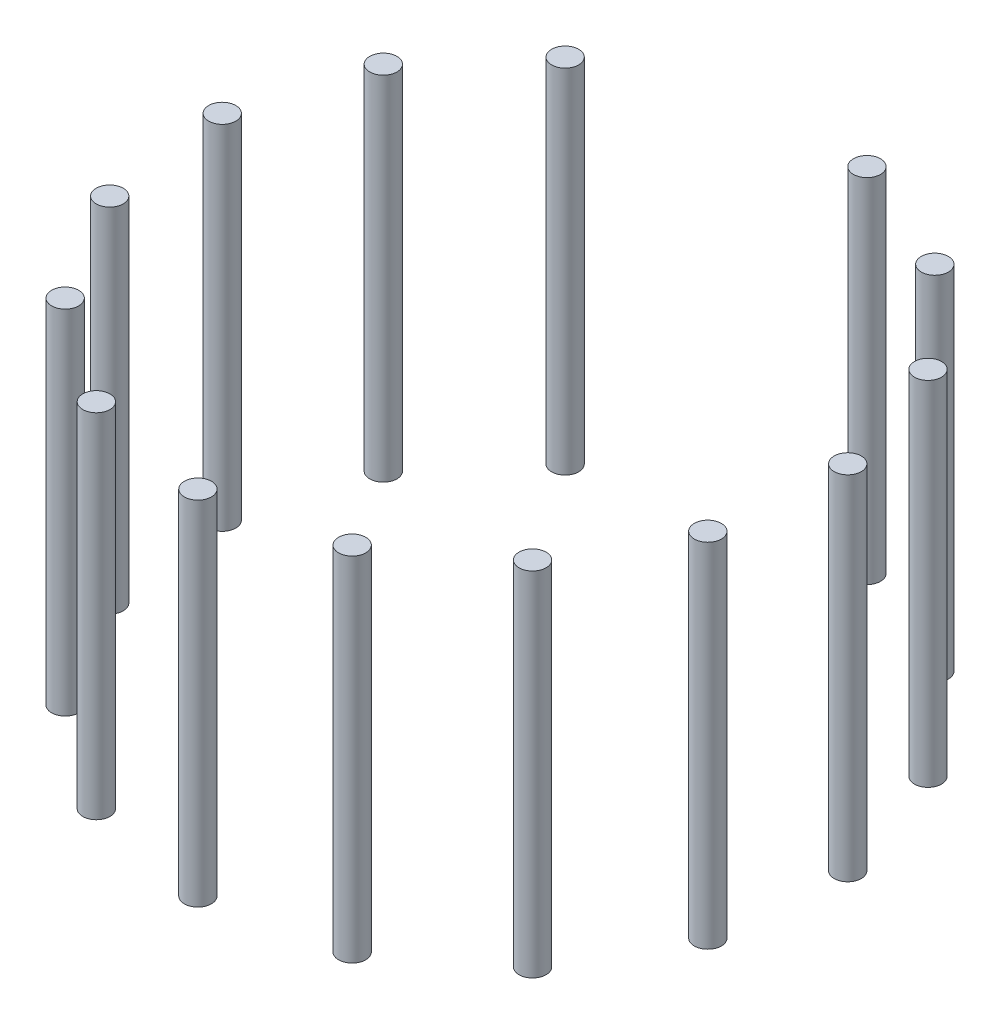
ISO-10303-21;
HEADER;
FILE_DESCRIPTION(('STEP AP214'),'2;1');
FILE_NAME('part.step','',(''),(''),'','','');
FILE_SCHEMA(('AUTOMOTIVE_DESIGN { 1 0 10303 214 1 1 1 1 }'));
ENDSEC;
DATA;
#1=APPLICATION_CONTEXT('core data for automotive mechanical design processes');
#2=APPLICATION_PROTOCOL_DEFINITION('international standard','automotive_design',2000,#1);
#3=PRODUCT_CONTEXT('',#1,'mechanical');
#4=PRODUCT('Part','Part','',(#3));
#5=PRODUCT_RELATED_PRODUCT_CATEGORY('part','',(#4));
#6=PRODUCT_DEFINITION_FORMATION('','',#4);
#7=PRODUCT_DEFINITION_CONTEXT('part definition',#1,'design');
#8=PRODUCT_DEFINITION('design','',#6,#7);
#9=PRODUCT_DEFINITION_SHAPE('','',#8);
#10=(LENGTH_UNIT() NAMED_UNIT(*) SI_UNIT(.MILLI.,.METRE.));
#11=(NAMED_UNIT(*) PLANE_ANGLE_UNIT() SI_UNIT($,.RADIAN.));
#12=(NAMED_UNIT(*) SI_UNIT($,.STERADIAN.) SOLID_ANGLE_UNIT());
#13=UNCERTAINTY_MEASURE_WITH_UNIT(LENGTH_MEASURE(1.E-05),#10,'distance_accuracy_value','');
#14=(GEOMETRIC_REPRESENTATION_CONTEXT(3) GLOBAL_UNCERTAINTY_ASSIGNED_CONTEXT((#13)) GLOBAL_UNIT_ASSIGNED_CONTEXT((#10,
#11,#12)) REPRESENTATION_CONTEXT('',''));
#15=CARTESIAN_POINT('',(0.,0.,0.));
#16=DIRECTION('',(0.,0.,1.));
#17=DIRECTION('',(1.,0.,0.));
#18=AXIS2_PLACEMENT_3D('',#15,#16,#17);
#19=CARTESIAN_POINT('',(8.64512657190612,9.1,-7.71661239147951));
#20=DIRECTION('',(0.,-1.,0.));
#21=DIRECTION('',(0.,0.,-1.));
#22=AXIS2_PLACEMENT_3D('',#19,#20,#21);
#23=CYLINDRICAL_SURFACE('',#22,0.350000000000002);
#24=CARTESIAN_POINT('',(8.64512657190612,9.1,-7.71661239147951));
#25=DIRECTION('',(0.,1.,0.));
#26=DIRECTION('',(0.,0.,1.));
#27=AXIS2_PLACEMENT_3D('',#24,#25,#26);
#28=CIRCLE('',#27,0.350000000000002);
#29=CARTESIAN_POINT('',(8.64512657190612,9.1,-7.36661239147951));
#30=VERTEX_POINT('',#29);
#31=EDGE_CURVE('E11',#30,#30,#28,.T.);
#32=ORIENTED_EDGE('',*,*,#31,.F.);
#33=EDGE_LOOP('',(#32));
#34=FACE_BOUND('',#33,.T.);
#35=CARTESIAN_POINT('',(8.64512657190612,0.,-7.71661239147951));
#36=DIRECTION('',(0.,1.,0.));
#37=DIRECTION('',(0.,0.,1.));
#38=AXIS2_PLACEMENT_3D('',#35,#36,#37);
#39=CIRCLE('',#38,0.350000000000002);
#40=CARTESIAN_POINT('',(8.64512657190612,0.,-7.36661239147951));
#41=VERTEX_POINT('',#40);
#42=EDGE_CURVE('E45',#41,#41,#39,.T.);
#43=ORIENTED_EDGE('',*,*,#42,.T.);
#44=EDGE_LOOP('',(#43));
#45=FACE_BOUND('',#44,.T.);
#46=ADVANCED_FACE('F42',(#34,#45),#23,.T.);
#47=CARTESIAN_POINT('',(8.64512657190612,9.1,-7.71661239147951));
#48=DIRECTION('',(0.,1.,0.));
#49=DIRECTION('',(0.,0.,1.));
#50=AXIS2_PLACEMENT_3D('',#47,#48,#49);
#51=PLANE('',#50);
#52=ORIENTED_EDGE('',*,*,#31,.T.);
#53=EDGE_LOOP('',(#52));
#54=FACE_BOUND('',#53,.T.);
#55=ADVANCED_FACE('F57',(#54),#51,.T.);
#56=CARTESIAN_POINT('',(8.64512657190612,0.,-7.71661239147951));
#57=DIRECTION('',(0.,1.,0.));
#58=DIRECTION('',(0.,0.,1.));
#59=AXIS2_PLACEMENT_3D('',#56,#57,#58);
#60=PLANE('',#59);
#61=ORIENTED_EDGE('',*,*,#42,.F.);
#62=EDGE_LOOP('',(#61));
#63=FACE_BOUND('',#62,.T.);
#64=ADVANCED_FACE('F55',(#63),#60,.F.);
#65=CLOSED_SHELL('',(#46,#55,#64));
#66=MANIFOLD_SOLID_BREP('B2',#65);
#67=CARTESIAN_POINT('',(6.45643612447235,9.1,-5.21145460262483));
#68=DIRECTION('',(0.,-1.,0.));
#69=DIRECTION('',(0.,0.,-1.));
#70=AXIS2_PLACEMENT_3D('',#67,#68,#69);
#71=CYLINDRICAL_SURFACE('',#70,0.35);
#72=CARTESIAN_POINT('',(6.45643612447235,9.1,-5.21145460262483));
#73=DIRECTION('',(0.,1.,0.));
#74=DIRECTION('',(0.,0.,1.));
#75=AXIS2_PLACEMENT_3D('',#72,#73,#74);
#76=CIRCLE('',#75,0.35);
#77=CARTESIAN_POINT('',(6.45643612447235,9.1,-4.86145460262483));
#78=VERTEX_POINT('',#77);
#79=EDGE_CURVE('E41',#78,#78,#76,.T.);
#80=ORIENTED_EDGE('',*,*,#79,.F.);
#81=EDGE_LOOP('',(#80));
#82=FACE_BOUND('',#81,.T.);
#83=CARTESIAN_POINT('',(6.45643612447235,0.,-5.21145460262483));
#84=DIRECTION('',(0.,1.,0.));
#85=DIRECTION('',(0.,0.,1.));
#86=AXIS2_PLACEMENT_3D('',#83,#84,#85);
#87=CIRCLE('',#86,0.35);
#88=CARTESIAN_POINT('',(6.45643612447235,0.,-4.86145460262483));
#89=VERTEX_POINT('',#88);
#90=EDGE_CURVE('E94',#89,#89,#87,.T.);
#91=ORIENTED_EDGE('',*,*,#90,.T.);
#92=EDGE_LOOP('',(#91));
#93=FACE_BOUND('',#92,.T.);
#94=ADVANCED_FACE('F91',(#82,#93),#71,.T.);
#95=CARTESIAN_POINT('',(6.45643612447235,9.1,-5.21145460262483));
#96=DIRECTION('',(0.,1.,0.));
#97=DIRECTION('',(0.,0.,1.));
#98=AXIS2_PLACEMENT_3D('',#95,#96,#97);
#99=PLANE('',#98);
#100=ORIENTED_EDGE('',*,*,#79,.T.);
#101=EDGE_LOOP('',(#100));
#102=FACE_BOUND('',#101,.T.);
#103=ADVANCED_FACE('F106',(#102),#99,.T.);
#104=CARTESIAN_POINT('',(6.45643612447235,0.,-5.21145460262483));
#105=DIRECTION('',(0.,1.,0.));
#106=DIRECTION('',(0.,0.,1.));
#107=AXIS2_PLACEMENT_3D('',#104,#105,#106);
#108=PLANE('',#107);
#109=ORIENTED_EDGE('',*,*,#90,.F.);
#110=EDGE_LOOP('',(#109));
#111=FACE_BOUND('',#110,.T.);
#112=ADVANCED_FACE('F104',(#111),#108,.F.);
#113=CLOSED_SHELL('',(#94,#103,#112));
#114=MANIFOLD_SOLID_BREP('B6',#113);
#115=CARTESIAN_POINT('',(5.47590737744742,9.1,-2.03265847861736));
#116=DIRECTION('',(0.,-1.,0.));
#117=DIRECTION('',(0.,0.,-1.));
#118=AXIS2_PLACEMENT_3D('',#115,#116,#117);
#119=CYLINDRICAL_SURFACE('',#118,0.35);
#120=CARTESIAN_POINT('',(5.47590737744742,9.1,-2.03265847861736));
#121=DIRECTION('',(0.,1.,0.));
#122=DIRECTION('',(0.,0.,1.));
#123=AXIS2_PLACEMENT_3D('',#120,#121,#122);
#124=CIRCLE('',#123,0.35);
#125=CARTESIAN_POINT('',(5.47590737744742,9.1,-1.68265847861736));
#126=VERTEX_POINT('',#125);
#127=EDGE_CURVE('E90',#126,#126,#124,.T.);
#128=ORIENTED_EDGE('',*,*,#127,.F.);
#129=EDGE_LOOP('',(#128));
#130=FACE_BOUND('',#129,.T.);
#131=CARTESIAN_POINT('',(5.47590737744742,0.,-2.03265847861736));
#132=DIRECTION('',(0.,1.,0.));
#133=DIRECTION('',(0.,0.,1.));
#134=AXIS2_PLACEMENT_3D('',#131,#132,#133);
#135=CIRCLE('',#134,0.35);
#136=CARTESIAN_POINT('',(5.47590737744742,0.,-1.68265847861736));
#137=VERTEX_POINT('',#136);
#138=EDGE_CURVE('E143',#137,#137,#135,.T.);
#139=ORIENTED_EDGE('',*,*,#138,.T.);
#140=EDGE_LOOP('',(#139));
#141=FACE_BOUND('',#140,.T.);
#142=ADVANCED_FACE('F140',(#130,#141),#119,.T.);
#143=CARTESIAN_POINT('',(5.47590737744742,9.1,-2.03265847861736));
#144=DIRECTION('',(0.,1.,0.));
#145=DIRECTION('',(0.,0.,1.));
#146=AXIS2_PLACEMENT_3D('',#143,#144,#145);
#147=PLANE('',#146);
#148=ORIENTED_EDGE('',*,*,#127,.T.);
#149=EDGE_LOOP('',(#148));
#150=FACE_BOUND('',#149,.T.);
#151=ADVANCED_FACE('F155',(#150),#147,.T.);
#152=CARTESIAN_POINT('',(5.47590737744742,0.,-2.03265847861736));
#153=DIRECTION('',(0.,1.,0.));
#154=DIRECTION('',(0.,0.,1.));
#155=AXIS2_PLACEMENT_3D('',#152,#153,#154);
#156=PLANE('',#155);
#157=ORIENTED_EDGE('',*,*,#138,.F.);
#158=EDGE_LOOP('',(#157));
#159=FACE_BOUND('',#158,.T.);
#160=ADVANCED_FACE('F153',(#159),#156,.F.);
#161=CLOSED_SHELL('',(#142,#151,#160));
#162=MANIFOLD_SOLID_BREP('B36',#161);
#163=CARTESIAN_POINT('',(5.87308265901598,9.1,1.2701332522458));
#164=DIRECTION('',(0.,-1.,0.));
#165=DIRECTION('',(0.,0.,-1.));
#166=AXIS2_PLACEMENT_3D('',#163,#164,#165);
#167=CYLINDRICAL_SURFACE('',#166,0.35);
#168=CARTESIAN_POINT('',(5.87308265901598,9.1,1.2701332522458));
#169=DIRECTION('',(0.,1.,0.));
#170=DIRECTION('',(0.,0.,1.));
#171=AXIS2_PLACEMENT_3D('',#168,#169,#170);
#172=CIRCLE('',#171,0.35);
#173=CARTESIAN_POINT('',(5.87308265901598,9.1,1.6201332522458));
#174=VERTEX_POINT('',#173);
#175=EDGE_CURVE('E139',#174,#174,#172,.T.);
#176=ORIENTED_EDGE('',*,*,#175,.F.);
#177=EDGE_LOOP('',(#176));
#178=FACE_BOUND('',#177,.T.);
#179=CARTESIAN_POINT('',(5.87308265901598,0.,1.2701332522458));
#180=DIRECTION('',(0.,1.,0.));
#181=DIRECTION('',(0.,0.,1.));
#182=AXIS2_PLACEMENT_3D('',#179,#180,#181);
#183=CIRCLE('',#182,0.35);
#184=CARTESIAN_POINT('',(5.87308265901598,0.,1.6201332522458));
#185=VERTEX_POINT('',#184);
#186=EDGE_CURVE('E192',#185,#185,#183,.T.);
#187=ORIENTED_EDGE('',*,*,#186,.T.);
#188=EDGE_LOOP('',(#187));
#189=FACE_BOUND('',#188,.T.);
#190=ADVANCED_FACE('F189',(#178,#189),#167,.T.);
#191=CARTESIAN_POINT('',(5.87308265901598,9.1,1.2701332522458));
#192=DIRECTION('',(0.,1.,0.));
#193=DIRECTION('',(0.,0.,1.));
#194=AXIS2_PLACEMENT_3D('',#191,#192,#193);
#195=PLANE('',#194);
#196=ORIENTED_EDGE('',*,*,#175,.T.);
#197=EDGE_LOOP('',(#196));
#198=FACE_BOUND('',#197,.T.);
#199=ADVANCED_FACE('F204',(#198),#195,.T.);
#200=CARTESIAN_POINT('',(5.87308265901598,0.,1.2701332522458));
#201=DIRECTION('',(0.,1.,0.));
#202=DIRECTION('',(0.,0.,1.));
#203=AXIS2_PLACEMENT_3D('',#200,#201,#202);
#204=PLANE('',#203);
#205=ORIENTED_EDGE('',*,*,#186,.F.);
#206=EDGE_LOOP('',(#205));
#207=FACE_BOUND('',#206,.T.);
#208=ADVANCED_FACE('F202',(#207),#204,.F.);
#209=CLOSED_SHELL('',(#190,#199,#208));
#210=MANIFOLD_SOLID_BREP('B85',#209);
#211=CARTESIAN_POINT('',(7.57928675477065,9.1,4.1258378947775));
#212=DIRECTION('',(0.,-1.,0.));
#213=DIRECTION('',(0.,0.,-1.));
#214=AXIS2_PLACEMENT_3D('',#211,#212,#213);
#215=CYLINDRICAL_SURFACE('',#214,0.349999999999999);
#216=CARTESIAN_POINT('',(7.57928675477065,9.1,4.1258378947775));
#217=DIRECTION('',(0.,1.,0.));
#218=DIRECTION('',(0.,0.,1.));
#219=AXIS2_PLACEMENT_3D('',#216,#217,#218);
#220=CIRCLE('',#219,0.349999999999999);
#221=CARTESIAN_POINT('',(7.57928675477065,9.1,4.47583789477749));
#222=VERTEX_POINT('',#221);
#223=EDGE_CURVE('E188',#222,#222,#220,.T.);
#224=ORIENTED_EDGE('',*,*,#223,.F.);
#225=EDGE_LOOP('',(#224));
#226=FACE_BOUND('',#225,.T.);
#227=CARTESIAN_POINT('',(7.57928675477065,0.,4.1258378947775));
#228=DIRECTION('',(0.,1.,0.));
#229=DIRECTION('',(0.,0.,1.));
#230=AXIS2_PLACEMENT_3D('',#227,#228,#229);
#231=CIRCLE('',#230,0.349999999999999);
#232=CARTESIAN_POINT('',(7.57928675477065,0.,4.47583789477749));
#233=VERTEX_POINT('',#232);
#234=EDGE_CURVE('E241',#233,#233,#231,.T.);
#235=ORIENTED_EDGE('',*,*,#234,.T.);
#236=EDGE_LOOP('',(#235));
#237=FACE_BOUND('',#236,.T.);
#238=ADVANCED_FACE('F238',(#226,#237),#215,.T.);
#239=CARTESIAN_POINT('',(7.57928675477065,9.1,4.1258378947775));
#240=DIRECTION('',(0.,1.,0.));
#241=DIRECTION('',(0.,0.,1.));
#242=AXIS2_PLACEMENT_3D('',#239,#240,#241);
#243=PLANE('',#242);
#244=ORIENTED_EDGE('',*,*,#223,.T.);
#245=EDGE_LOOP('',(#244));
#246=FACE_BOUND('',#245,.T.);
#247=ADVANCED_FACE('F253',(#246),#243,.T.);
#248=CARTESIAN_POINT('',(7.57928675477065,0.,4.1258378947775));
#249=DIRECTION('',(0.,1.,0.));
#250=DIRECTION('',(0.,0.,1.));
#251=AXIS2_PLACEMENT_3D('',#248,#249,#250);
#252=PLANE('',#251);
#253=ORIENTED_EDGE('',*,*,#234,.F.);
#254=EDGE_LOOP('',(#253));
#255=FACE_BOUND('',#254,.T.);
#256=ADVANCED_FACE('F251',(#255),#252,.F.);
#257=CLOSED_SHELL('',(#238,#247,#256));
#258=MANIFOLD_SOLID_BREP('B134',#257);
#259=CARTESIAN_POINT('',(10.2995014761779,9.1,6.04067817302178));
#260=DIRECTION('',(0.,-1.,0.));
#261=DIRECTION('',(0.,0.,-1.));
#262=AXIS2_PLACEMENT_3D('',#259,#260,#261);
#263=CYLINDRICAL_SURFACE('',#262,0.35);
#264=CARTESIAN_POINT('',(10.2995014761779,9.1,6.04067817302178));
#265=DIRECTION('',(0.,1.,0.));
#266=DIRECTION('',(0.,0.,1.));
#267=AXIS2_PLACEMENT_3D('',#264,#265,#266);
#268=CIRCLE('',#267,0.35);
#269=CARTESIAN_POINT('',(10.2995014761779,9.1,6.39067817302178));
#270=VERTEX_POINT('',#269);
#271=EDGE_CURVE('E237',#270,#270,#268,.T.);
#272=ORIENTED_EDGE('',*,*,#271,.F.);
#273=EDGE_LOOP('',(#272));
#274=FACE_BOUND('',#273,.T.);
#275=CARTESIAN_POINT('',(10.2995014761779,0.,6.04067817302178));
#276=DIRECTION('',(0.,1.,0.));
#277=DIRECTION('',(0.,0.,1.));
#278=AXIS2_PLACEMENT_3D('',#275,#276,#277);
#279=CIRCLE('',#278,0.35);
#280=CARTESIAN_POINT('',(10.2995014761779,0.,6.39067817302178));
#281=VERTEX_POINT('',#280);
#282=EDGE_CURVE('E290',#281,#281,#279,.T.);
#283=ORIENTED_EDGE('',*,*,#282,.T.);
#284=EDGE_LOOP('',(#283));
#285=FACE_BOUND('',#284,.T.);
#286=ADVANCED_FACE('F287',(#274,#285),#263,.T.);
#287=CARTESIAN_POINT('',(10.2995014761779,9.1,6.04067817302178));
#288=DIRECTION('',(0.,1.,0.));
#289=DIRECTION('',(0.,0.,1.));
#290=AXIS2_PLACEMENT_3D('',#287,#288,#289);
#291=PLANE('',#290);
#292=ORIENTED_EDGE('',*,*,#271,.T.);
#293=EDGE_LOOP('',(#292));
#294=FACE_BOUND('',#293,.T.);
#295=ADVANCED_FACE('F302',(#294),#291,.T.);
#296=CARTESIAN_POINT('',(10.2995014761779,0.,6.04067817302178));
#297=DIRECTION('',(0.,1.,0.));
#298=DIRECTION('',(0.,0.,1.));
#299=AXIS2_PLACEMENT_3D('',#296,#297,#298);
#300=PLANE('',#299);
#301=ORIENTED_EDGE('',*,*,#282,.F.);
#302=EDGE_LOOP('',(#301));
#303=FACE_BOUND('',#302,.T.);
#304=ADVANCED_FACE('F300',(#303),#300,.F.);
#305=CLOSED_SHELL('',(#286,#295,#304));
#306=MANIFOLD_SOLID_BREP('B183',#305);
#307=CARTESIAN_POINT('',(13.5633769855314,9.1,6.68356080709241));
#308=DIRECTION('',(0.,-1.,0.));
#309=DIRECTION('',(0.,0.,-1.));
#310=AXIS2_PLACEMENT_3D('',#307,#308,#309);
#311=CYLINDRICAL_SURFACE('',#310,0.349999999999999);
#312=CARTESIAN_POINT('',(13.5633769855314,9.1,6.68356080709241));
#313=DIRECTION('',(0.,1.,0.));
#314=DIRECTION('',(0.,0.,1.));
#315=AXIS2_PLACEMENT_3D('',#312,#313,#314);
#316=CIRCLE('',#315,0.349999999999999);
#317=CARTESIAN_POINT('',(13.5633769855314,9.1,7.03356080709241));
#318=VERTEX_POINT('',#317);
#319=EDGE_CURVE('E286',#318,#318,#316,.T.);
#320=ORIENTED_EDGE('',*,*,#319,.F.);
#321=EDGE_LOOP('',(#320));
#322=FACE_BOUND('',#321,.T.);
#323=CARTESIAN_POINT('',(13.5633769855314,0.,6.68356080709241));
#324=DIRECTION('',(0.,1.,0.));
#325=DIRECTION('',(0.,0.,1.));
#326=AXIS2_PLACEMENT_3D('',#323,#324,#325);
#327=CIRCLE('',#326,0.349999999999999);
#328=CARTESIAN_POINT('',(13.5633769855314,0.,7.03356080709241));
#329=VERTEX_POINT('',#328);
#330=EDGE_CURVE('E339',#329,#329,#327,.T.);
#331=ORIENTED_EDGE('',*,*,#330,.T.);
#332=EDGE_LOOP('',(#331));
#333=FACE_BOUND('',#332,.T.);
#334=ADVANCED_FACE('F336',(#322,#333),#311,.T.);
#335=CARTESIAN_POINT('',(13.5633769855314,9.1,6.68356080709241));
#336=DIRECTION('',(0.,1.,0.));
#337=DIRECTION('',(0.,0.,1.));
#338=AXIS2_PLACEMENT_3D('',#335,#336,#337);
#339=PLANE('',#338);
#340=ORIENTED_EDGE('',*,*,#319,.T.);
#341=EDGE_LOOP('',(#340));
#342=FACE_BOUND('',#341,.T.);
#343=ADVANCED_FACE('F351',(#342),#339,.T.);
#344=CARTESIAN_POINT('',(13.5633769855314,0.,6.68356080709241));
#345=DIRECTION('',(0.,1.,0.));
#346=DIRECTION('',(0.,0.,1.));
#347=AXIS2_PLACEMENT_3D('',#344,#345,#346);
#348=PLANE('',#347);
#349=ORIENTED_EDGE('',*,*,#330,.F.);
#350=EDGE_LOOP('',(#349));
#351=FACE_BOUND('',#350,.T.);
#352=ADVANCED_FACE('F349',(#351),#348,.F.);
#353=CLOSED_SHELL('',(#334,#343,#352));
#354=MANIFOLD_SOLID_BREP('B232',#353);
#355=CARTESIAN_POINT('',(16.8065595558858,9.1,5.94332554915316));
#356=DIRECTION('',(0.,-1.,0.));
#357=DIRECTION('',(0.,0.,-1.));
#358=AXIS2_PLACEMENT_3D('',#355,#356,#357);
#359=CYLINDRICAL_SURFACE('',#358,0.350000000000003);
#360=CARTESIAN_POINT('',(16.8065595558858,9.1,5.94332554915316));
#361=DIRECTION('',(0.,1.,0.));
#362=DIRECTION('',(0.,0.,1.));
#363=AXIS2_PLACEMENT_3D('',#360,#361,#362);
#364=CIRCLE('',#363,0.350000000000003);
#365=CARTESIAN_POINT('',(16.8065595558858,9.1,6.29332554915316));
#366=VERTEX_POINT('',#365);
#367=EDGE_CURVE('E335',#366,#366,#364,.T.);
#368=ORIENTED_EDGE('',*,*,#367,.F.);
#369=EDGE_LOOP('',(#368));
#370=FACE_BOUND('',#369,.T.);
#371=CARTESIAN_POINT('',(16.8065595558858,0.,5.94332554915316));
#372=DIRECTION('',(0.,1.,0.));
#373=DIRECTION('',(0.,0.,1.));
#374=AXIS2_PLACEMENT_3D('',#371,#372,#373);
#375=CIRCLE('',#374,0.350000000000003);
#376=CARTESIAN_POINT('',(16.8065595558858,0.,6.29332554915316));
#377=VERTEX_POINT('',#376);
#378=EDGE_CURVE('E388',#377,#377,#375,.T.);
#379=ORIENTED_EDGE('',*,*,#378,.T.);
#380=EDGE_LOOP('',(#379));
#381=FACE_BOUND('',#380,.T.);
#382=ADVANCED_FACE('F385',(#370,#381),#359,.T.);
#383=CARTESIAN_POINT('',(16.8065595558858,9.1,5.94332554915316));
#384=DIRECTION('',(0.,1.,0.));
#385=DIRECTION('',(0.,0.,1.));
#386=AXIS2_PLACEMENT_3D('',#383,#384,#385);
#387=PLANE('',#386);
#388=ORIENTED_EDGE('',*,*,#367,.T.);
#389=EDGE_LOOP('',(#388));
#390=FACE_BOUND('',#389,.T.);
#391=ADVANCED_FACE('F400',(#390),#387,.T.);
#392=CARTESIAN_POINT('',(16.8065595558858,0.,5.94332554915316));
#393=DIRECTION('',(0.,1.,0.));
#394=DIRECTION('',(0.,0.,1.));
#395=AXIS2_PLACEMENT_3D('',#392,#393,#394);
#396=PLANE('',#395);
#397=ORIENTED_EDGE('',*,*,#378,.F.);
#398=EDGE_LOOP('',(#397));
#399=FACE_BOUND('',#398,.T.);
#400=ADVANCED_FACE('F398',(#399),#396,.F.);
#401=CLOSED_SHELL('',(#382,#391,#400));
#402=MANIFOLD_SOLID_BREP('B281',#401);
#403=CARTESIAN_POINT('',(19.4682734574382,9.1,3.94796580012796));
#404=DIRECTION('',(0.,-1.,0.));
#405=DIRECTION('',(0.,0.,-1.));
#406=AXIS2_PLACEMENT_3D('',#403,#404,#405);
#407=CYLINDRICAL_SURFACE('',#406,0.349999999999999);
#408=CARTESIAN_POINT('',(19.4682734574382,9.1,3.94796580012796));
#409=DIRECTION('',(0.,1.,0.));
#410=DIRECTION('',(0.,0.,1.));
#411=AXIS2_PLACEMENT_3D('',#408,#409,#410);
#412=CIRCLE('',#411,0.349999999999999);
#413=CARTESIAN_POINT('',(19.4682734574382,9.1,4.29796580012796));
#414=VERTEX_POINT('',#413);
#415=EDGE_CURVE('E384',#414,#414,#412,.T.);
#416=ORIENTED_EDGE('',*,*,#415,.F.);
#417=EDGE_LOOP('',(#416));
#418=FACE_BOUND('',#417,.T.);
#419=CARTESIAN_POINT('',(19.4682734574382,0.,3.94796580012796));
#420=DIRECTION('',(0.,1.,0.));
#421=DIRECTION('',(0.,0.,1.));
#422=AXIS2_PLACEMENT_3D('',#419,#420,#421);
#423=CIRCLE('',#422,0.349999999999999);
#424=CARTESIAN_POINT('',(19.4682734574382,0.,4.29796580012796));
#425=VERTEX_POINT('',#424);
#426=EDGE_CURVE('E437',#425,#425,#423,.T.);
#427=ORIENTED_EDGE('',*,*,#426,.T.);
#428=EDGE_LOOP('',(#427));
#429=FACE_BOUND('',#428,.T.);
#430=ADVANCED_FACE('F434',(#418,#429),#407,.T.);
#431=CARTESIAN_POINT('',(19.4682734574382,9.1,3.94796580012796));
#432=DIRECTION('',(0.,1.,0.));
#433=DIRECTION('',(0.,0.,1.));
#434=AXIS2_PLACEMENT_3D('',#431,#432,#433);
#435=PLANE('',#434);
#436=ORIENTED_EDGE('',*,*,#415,.T.);
#437=EDGE_LOOP('',(#436));
#438=FACE_BOUND('',#437,.T.);
#439=ADVANCED_FACE('F449',(#438),#435,.T.);
#440=CARTESIAN_POINT('',(19.4682734574382,0.,3.94796580012796));
#441=DIRECTION('',(0.,1.,0.));
#442=DIRECTION('',(0.,0.,1.));
#443=AXIS2_PLACEMENT_3D('',#440,#441,#442);
#444=PLANE('',#443);
#445=ORIENTED_EDGE('',*,*,#426,.F.);
#446=EDGE_LOOP('',(#445));
#447=FACE_BOUND('',#446,.T.);
#448=ADVANCED_FACE('F447',(#447),#444,.F.);
#449=CLOSED_SHELL('',(#430,#439,#448));
#450=MANIFOLD_SOLID_BREP('B330',#449);
#451=CARTESIAN_POINT('',(21.0882841756984,9.1,1.04249738789751));
#452=DIRECTION('',(0.,-1.,0.));
#453=DIRECTION('',(0.,0.,-1.));
#454=AXIS2_PLACEMENT_3D('',#451,#452,#453);
#455=CYLINDRICAL_SURFACE('',#454,0.35);
#456=CARTESIAN_POINT('',(21.0882841756984,9.1,1.04249738789751));
#457=DIRECTION('',(0.,1.,0.));
#458=DIRECTION('',(0.,0.,1.));
#459=AXIS2_PLACEMENT_3D('',#456,#457,#458);
#460=CIRCLE('',#459,0.35);
#461=CARTESIAN_POINT('',(21.0882841756984,9.1,1.39249738789751));
#462=VERTEX_POINT('',#461);
#463=EDGE_CURVE('E433',#462,#462,#460,.T.);
#464=ORIENTED_EDGE('',*,*,#463,.F.);
#465=EDGE_LOOP('',(#464));
#466=FACE_BOUND('',#465,.T.);
#467=CARTESIAN_POINT('',(21.0882841756984,0.,1.04249738789751));
#468=DIRECTION('',(0.,1.,0.));
#469=DIRECTION('',(0.,0.,1.));
#470=AXIS2_PLACEMENT_3D('',#467,#468,#469);
#471=CIRCLE('',#470,0.35);
#472=CARTESIAN_POINT('',(21.0882841756984,0.,1.39249738789751));
#473=VERTEX_POINT('',#472);
#474=EDGE_CURVE('E486',#473,#473,#471,.T.);
#475=ORIENTED_EDGE('',*,*,#474,.T.);
#476=EDGE_LOOP('',(#475));
#477=FACE_BOUND('',#476,.T.);
#478=ADVANCED_FACE('F483',(#466,#477),#455,.T.);
#479=CARTESIAN_POINT('',(21.0882841756984,9.1,1.04249738789751));
#480=DIRECTION('',(0.,1.,0.));
#481=DIRECTION('',(0.,0.,1.));
#482=AXIS2_PLACEMENT_3D('',#479,#480,#481);
#483=PLANE('',#482);
#484=ORIENTED_EDGE('',*,*,#463,.T.);
#485=EDGE_LOOP('',(#484));
#486=FACE_BOUND('',#485,.T.);
#487=ADVANCED_FACE('F498',(#486),#483,.T.);
#488=CARTESIAN_POINT('',(21.0882841756984,0.,1.04249738789751));
#489=DIRECTION('',(0.,1.,0.));
#490=DIRECTION('',(0.,0.,1.));
#491=AXIS2_PLACEMENT_3D('',#488,#489,#490);
#492=PLANE('',#491);
#493=ORIENTED_EDGE('',*,*,#474,.F.);
#494=EDGE_LOOP('',(#493));
#495=FACE_BOUND('',#494,.T.);
#496=ADVANCED_FACE('F496',(#495),#492,.F.);
#497=CLOSED_SHELL('',(#478,#487,#496));
#498=MANIFOLD_SOLID_BREP('B379',#497);
#499=CARTESIAN_POINT('',(21.386477140144,9.1,-2.27069780371169));
#500=DIRECTION('',(0.,-1.,0.));
#501=DIRECTION('',(0.,0.,-1.));
#502=AXIS2_PLACEMENT_3D('',#499,#500,#501);
#503=CYLINDRICAL_SURFACE('',#502,0.35);
#504=CARTESIAN_POINT('',(21.386477140144,9.1,-2.27069780371169));
#505=DIRECTION('',(0.,1.,0.));
#506=DIRECTION('',(0.,0.,1.));
#507=AXIS2_PLACEMENT_3D('',#504,#505,#506);
#508=CIRCLE('',#507,0.35);
#509=CARTESIAN_POINT('',(21.386477140144,9.1,-1.92069780371169));
#510=VERTEX_POINT('',#509);
#511=EDGE_CURVE('E482',#510,#510,#508,.T.);
#512=ORIENTED_EDGE('',*,*,#511,.F.);
#513=EDGE_LOOP('',(#512));
#514=FACE_BOUND('',#513,.T.);
#515=CARTESIAN_POINT('',(21.386477140144,0.,-2.27069780371169));
#516=DIRECTION('',(0.,1.,0.));
#517=DIRECTION('',(0.,0.,1.));
#518=AXIS2_PLACEMENT_3D('',#515,#516,#517);
#519=CIRCLE('',#518,0.35);
#520=CARTESIAN_POINT('',(21.386477140144,0.,-1.92069780371169));
#521=VERTEX_POINT('',#520);
#522=EDGE_CURVE('E535',#521,#521,#519,.T.);
#523=ORIENTED_EDGE('',*,*,#522,.T.);
#524=EDGE_LOOP('',(#523));
#525=FACE_BOUND('',#524,.T.);
#526=ADVANCED_FACE('F532',(#514,#525),#503,.T.);
#527=CARTESIAN_POINT('',(21.386477140144,9.1,-2.27069780371169));
#528=DIRECTION('',(0.,1.,0.));
#529=DIRECTION('',(0.,0.,1.));
#530=AXIS2_PLACEMENT_3D('',#527,#528,#529);
#531=PLANE('',#530);
#532=ORIENTED_EDGE('',*,*,#511,.T.);
#533=EDGE_LOOP('',(#532));
#534=FACE_BOUND('',#533,.T.);
#535=ADVANCED_FACE('F547',(#534),#531,.T.);
#536=CARTESIAN_POINT('',(21.386477140144,0.,-2.27069780371169));
#537=DIRECTION('',(0.,1.,0.));
#538=DIRECTION('',(0.,0.,1.));
#539=AXIS2_PLACEMENT_3D('',#536,#537,#538);
#540=PLANE('',#539);
#541=ORIENTED_EDGE('',*,*,#522,.F.);
#542=EDGE_LOOP('',(#541));
#543=FACE_BOUND('',#542,.T.);
#544=ADVANCED_FACE('F545',(#543),#540,.F.);
#545=CLOSED_SHELL('',(#526,#535,#544));
#546=MANIFOLD_SOLID_BREP('B428',#545);
#547=CARTESIAN_POINT('',(20.3112920782243,9.1,-5.418738226637));
#548=DIRECTION('',(0.,-1.,0.));
#549=DIRECTION('',(0.,0.,-1.));
#550=AXIS2_PLACEMENT_3D('',#547,#548,#549);
#551=CYLINDRICAL_SURFACE('',#550,0.349999999999998);
#552=CARTESIAN_POINT('',(20.3112920782243,9.1,-5.418738226637));
#553=DIRECTION('',(0.,1.,0.));
#554=DIRECTION('',(0.,0.,1.));
#555=AXIS2_PLACEMENT_3D('',#552,#553,#554);
#556=CIRCLE('',#555,0.349999999999998);
#557=CARTESIAN_POINT('',(20.3112920782243,9.1,-5.068738226637));
#558=VERTEX_POINT('',#557);
#559=EDGE_CURVE('E531',#558,#558,#556,.T.);
#560=ORIENTED_EDGE('',*,*,#559,.F.);
#561=EDGE_LOOP('',(#560));
#562=FACE_BOUND('',#561,.T.);
#563=CARTESIAN_POINT('',(20.3112920782243,0.,-5.418738226637));
#564=DIRECTION('',(0.,1.,0.));
#565=DIRECTION('',(0.,0.,1.));
#566=AXIS2_PLACEMENT_3D('',#563,#564,#565);
#567=CIRCLE('',#566,0.349999999999998);
#568=CARTESIAN_POINT('',(20.3112920782243,0.,-5.068738226637));
#569=VERTEX_POINT('',#568);
#570=EDGE_CURVE('E584',#569,#569,#567,.T.);
#571=ORIENTED_EDGE('',*,*,#570,.T.);
#572=EDGE_LOOP('',(#571));
#573=FACE_BOUND('',#572,.T.);
#574=ADVANCED_FACE('F581',(#562,#573),#551,.T.);
#575=CARTESIAN_POINT('',(20.3112920782243,9.1,-5.418738226637));
#576=DIRECTION('',(0.,1.,0.));
#577=DIRECTION('',(0.,0.,1.));
#578=AXIS2_PLACEMENT_3D('',#575,#576,#577);
#579=PLANE('',#578);
#580=ORIENTED_EDGE('',*,*,#559,.T.);
#581=EDGE_LOOP('',(#580));
#582=FACE_BOUND('',#581,.T.);
#583=ADVANCED_FACE('F596',(#582),#579,.T.);
#584=CARTESIAN_POINT('',(20.3112920782243,0.,-5.418738226637));
#585=DIRECTION('',(0.,1.,0.));
#586=DIRECTION('',(0.,0.,1.));
#587=AXIS2_PLACEMENT_3D('',#584,#585,#586);
#588=PLANE('',#587);
#589=ORIENTED_EDGE('',*,*,#570,.F.);
#590=EDGE_LOOP('',(#589));
#591=FACE_BOUND('',#590,.T.);
#592=ADVANCED_FACE('F594',(#591),#588,.F.);
#593=CLOSED_SHELL('',(#574,#583,#592));
#594=MANIFOLD_SOLID_BREP('B477',#593);
#595=CARTESIAN_POINT('',(18.0486382548948,9.1,-7.85729909270522));
#596=DIRECTION('',(0.,-1.,0.));
#597=DIRECTION('',(0.,0.,-1.));
#598=AXIS2_PLACEMENT_3D('',#595,#596,#597);
#599=CYLINDRICAL_SURFACE('',#598,0.35);
#600=CARTESIAN_POINT('',(18.0486382548948,9.1,-7.85729909270522));
#601=DIRECTION('',(0.,1.,0.));
#602=DIRECTION('',(0.,0.,1.));
#603=AXIS2_PLACEMENT_3D('',#600,#601,#602);
#604=CIRCLE('',#603,0.35);
#605=CARTESIAN_POINT('',(18.0486382548948,9.1,-7.50729909270522));
#606=VERTEX_POINT('',#605);
#607=EDGE_CURVE('E580',#606,#606,#604,.T.);
#608=ORIENTED_EDGE('',*,*,#607,.F.);
#609=EDGE_LOOP('',(#608));
#610=FACE_BOUND('',#609,.T.);
#611=CARTESIAN_POINT('',(18.0486382548948,0.,-7.85729909270522));
#612=DIRECTION('',(0.,1.,0.));
#613=DIRECTION('',(0.,0.,1.));
#614=AXIS2_PLACEMENT_3D('',#611,#612,#613);
#615=CIRCLE('',#614,0.35);
#616=CARTESIAN_POINT('',(18.0486382548948,0.,-7.50729909270522));
#617=VERTEX_POINT('',#616);
#618=EDGE_CURVE('E632',#617,#617,#615,.T.);
#619=ORIENTED_EDGE('',*,*,#618,.T.);
#620=EDGE_LOOP('',(#619));
#621=FACE_BOUND('',#620,.T.);
#622=ADVANCED_FACE('F629',(#610,#621),#599,.T.);
#623=CARTESIAN_POINT('',(18.0486382548948,9.1,-7.85729909270522));
#624=DIRECTION('',(0.,1.,0.));
#625=DIRECTION('',(0.,0.,1.));
#626=AXIS2_PLACEMENT_3D('',#623,#624,#625);
#627=PLANE('',#626);
#628=ORIENTED_EDGE('',*,*,#607,.T.);
#629=EDGE_LOOP('',(#628));
#630=FACE_BOUND('',#629,.T.);
#631=ADVANCED_FACE('F644',(#630),#627,.T.);
#632=CARTESIAN_POINT('',(18.0486382548948,0.,-7.85729909270522));
#633=DIRECTION('',(0.,1.,0.));
#634=DIRECTION('',(0.,0.,1.));
#635=AXIS2_PLACEMENT_3D('',#632,#633,#634);
#636=PLANE('',#635);
#637=ORIENTED_EDGE('',*,*,#618,.F.);
#638=EDGE_LOOP('',(#637));
#639=FACE_BOUND('',#638,.T.);
#640=ADVANCED_FACE('F642',(#639),#636,.F.);
#641=CLOSED_SHELL('',(#622,#631,#640));
#642=MANIFOLD_SOLID_BREP('B526',#641);
#643=CARTESIAN_POINT('',(14.9897490717738,9.1,-9.16473107454316));
#644=DIRECTION('',(0.,-1.,0.));
#645=DIRECTION('',(0.,0.,-1.));
#646=AXIS2_PLACEMENT_3D('',#643,#644,#645);
#647=CYLINDRICAL_SURFACE('',#646,0.350000000000001);
#648=CARTESIAN_POINT('',(14.9897490717738,9.1,-9.16473107454316));
#649=DIRECTION('',(0.,1.,0.));
#650=DIRECTION('',(0.,0.,1.));
#651=AXIS2_PLACEMENT_3D('',#648,#649,#650);
#652=CIRCLE('',#651,0.350000000000001);
#653=CARTESIAN_POINT('',(14.9897490717738,9.1,-8.81473107454316));
#654=VERTEX_POINT('',#653);
#655=EDGE_CURVE('E628',#654,#654,#652,.T.);
#656=ORIENTED_EDGE('',*,*,#655,.F.);
#657=EDGE_LOOP('',(#656));
#658=FACE_BOUND('',#657,.T.);
#659=CARTESIAN_POINT('',(14.9897490717738,0.,-9.16473107454316));
#660=DIRECTION('',(0.,1.,0.));
#661=DIRECTION('',(0.,0.,1.));
#662=AXIS2_PLACEMENT_3D('',#659,#660,#661);
#663=CIRCLE('',#662,0.350000000000001);
#664=CARTESIAN_POINT('',(14.9897490717738,0.,-8.81473107454316));
#665=VERTEX_POINT('',#664);
#666=EDGE_CURVE('E673',#665,#665,#663,.T.);
#667=ORIENTED_EDGE('',*,*,#666,.T.);
#668=EDGE_LOOP('',(#667));
#669=FACE_BOUND('',#668,.T.);
#670=ADVANCED_FACE('F670',(#658,#669),#647,.T.);
#671=CARTESIAN_POINT('',(14.9897490717738,9.1,-9.16473107454316));
#672=DIRECTION('',(0.,1.,0.));
#673=DIRECTION('',(0.,0.,1.));
#674=AXIS2_PLACEMENT_3D('',#671,#672,#673);
#675=PLANE('',#674);
#676=ORIENTED_EDGE('',*,*,#655,.T.);
#677=EDGE_LOOP('',(#676));
#678=FACE_BOUND('',#677,.T.);
#679=ADVANCED_FACE('F685',(#678),#675,.T.);
#680=CARTESIAN_POINT('',(14.9897490717738,0.,-9.16473107454316));
#681=DIRECTION('',(0.,1.,0.));
#682=DIRECTION('',(0.,0.,1.));
#683=AXIS2_PLACEMENT_3D('',#680,#681,#682);
#684=PLANE('',#683);
#685=ORIENTED_EDGE('',*,*,#666,.F.);
#686=EDGE_LOOP('',(#685));
#687=FACE_BOUND('',#686,.T.);
#688=ADVANCED_FACE('F683',(#687),#684,.F.);
#689=CLOSED_SHELL('',(#670,#679,#688));
#690=MANIFOLD_SOLID_BREP('B575',#689);
#691=ADVANCED_BREP_SHAPE_REPRESENTATION('',(#18,#66,#114,#162,#210,#258,#306,#354,#402,#450,
#498,#546,#594,#642,#690),#14);
#692=SHAPE_DEFINITION_REPRESENTATION(#9,#691);
ENDSEC;
END-ISO-10303-21;
